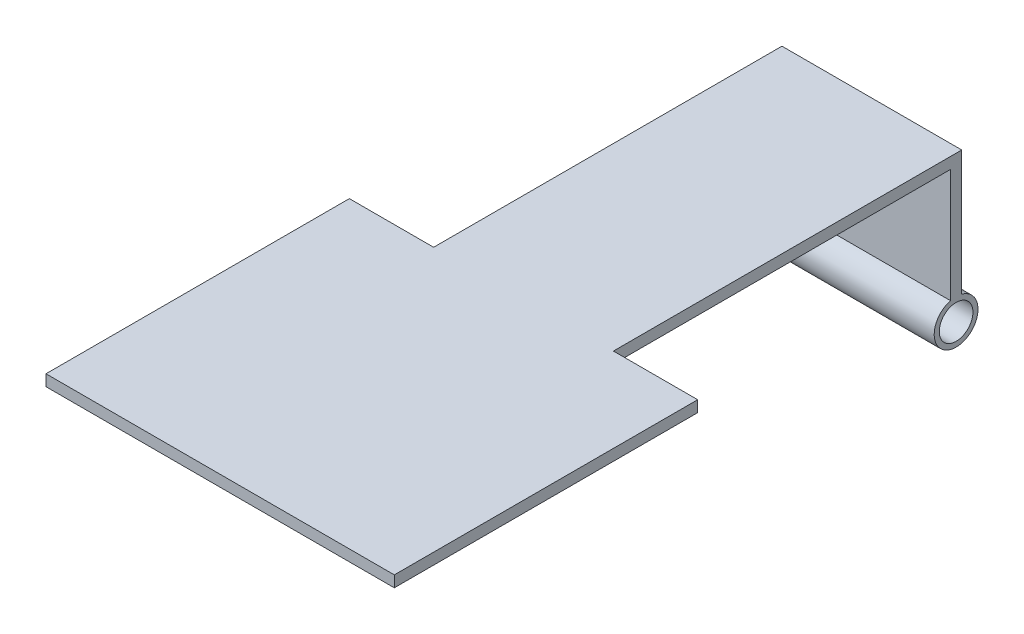
ISO-10303-21;
HEADER;
FILE_DESCRIPTION(('STEP AP214'),'2;1');
FILE_NAME('part.step','',(''),(''),'','','');
FILE_SCHEMA(('AUTOMOTIVE_DESIGN { 1 0 10303 214 1 1 1 1 }'));
ENDSEC;
DATA;
#1=APPLICATION_CONTEXT('core data for automotive mechanical design processes');
#2=APPLICATION_PROTOCOL_DEFINITION('international standard','automotive_design',2000,#1);
#3=PRODUCT_CONTEXT('',#1,'mechanical');
#4=PRODUCT('Part','Part','',(#3));
#5=PRODUCT_RELATED_PRODUCT_CATEGORY('part','',(#4));
#6=PRODUCT_DEFINITION_FORMATION('','',#4);
#7=PRODUCT_DEFINITION_CONTEXT('part definition',#1,'design');
#8=PRODUCT_DEFINITION('design','',#6,#7);
#9=PRODUCT_DEFINITION_SHAPE('','',#8);
#10=(LENGTH_UNIT() NAMED_UNIT(*) SI_UNIT(.MILLI.,.METRE.));
#11=(NAMED_UNIT(*) PLANE_ANGLE_UNIT() SI_UNIT($,.RADIAN.));
#12=(NAMED_UNIT(*) SI_UNIT($,.STERADIAN.) SOLID_ANGLE_UNIT());
#13=UNCERTAINTY_MEASURE_WITH_UNIT(LENGTH_MEASURE(1.E-05),#10,'distance_accuracy_value','');
#14=(GEOMETRIC_REPRESENTATION_CONTEXT(3) GLOBAL_UNCERTAINTY_ASSIGNED_CONTEXT((#13)) GLOBAL_UNIT_ASSIGNED_CONTEXT((#10,
#11,#12)) REPRESENTATION_CONTEXT('',''));
#15=CARTESIAN_POINT('',(0.,0.,0.));
#16=DIRECTION('',(0.,0.,1.));
#17=DIRECTION('',(1.,0.,0.));
#18=AXIS2_PLACEMENT_3D('',#15,#16,#17);
#19=CARTESIAN_POINT('',(16.,0.,0.500534490034142));
#20=DIRECTION('',(0.,0.,-1.));
#21=DIRECTION('',(0.,1.,0.));
#22=AXIS2_PLACEMENT_3D('',#19,#20,#21);
#23=PLANE('',#22);
#24=DIRECTION('',(1.,0.,0.));
#25=VECTOR('',#24,1.);
#26=CARTESIAN_POINT('',(0.,11.9998860247831,0.500534490034143));
#27=LINE('',#26,#25);
#28=CARTESIAN_POINT('',(0.,11.9998860247831,0.500534490034143));
#29=VERTEX_POINT('',#28);
#30=CARTESIAN_POINT('',(16.,11.9998860247831,0.500534490034143));
#31=VERTEX_POINT('',#30);
#32=EDGE_CURVE('E151',#29,#31,#27,.T.);
#33=ORIENTED_EDGE('',*,*,#32,.F.);
#34=DIRECTION('',(0.,-1.,0.));
#35=VECTOR('',#34,1.);
#36=CARTESIAN_POINT('',(0.,0.,0.500534490034142));
#37=LINE('',#36,#35);
#38=CARTESIAN_POINT('',(0.,1.88466581236204,0.500534490034142));
#39=VERTEX_POINT('',#38);
#40=EDGE_CURVE('E194',#29,#39,#37,.T.);
#41=ORIENTED_EDGE('',*,*,#40,.T.);
#42=DIRECTION('',(-1.,0.,0.));
#43=VECTOR('',#42,1.);
#44=CARTESIAN_POINT('',(16.,1.88466581236204,0.500534490034142));
#45=LINE('',#44,#43);
#46=CARTESIAN_POINT('',(16.,1.88466581236204,0.500534490034142));
#47=VERTEX_POINT('',#46);
#48=EDGE_CURVE('E11',#47,#39,#45,.T.);
#49=ORIENTED_EDGE('',*,*,#48,.F.);
#50=DIRECTION('',(0.,-1.,0.));
#51=VECTOR('',#50,1.);
#52=CARTESIAN_POINT('',(16.,0.,0.500534490034142));
#53=LINE('',#52,#51);
#54=EDGE_CURVE('E50',#31,#47,#53,.T.);
#55=ORIENTED_EDGE('',*,*,#54,.F.);
#56=EDGE_LOOP('',(#33,#41,#49,#55));
#57=FACE_BOUND('',#56,.T.);
#58=ADVANCED_FACE('F35',(#57),#23,.F.);
#59=CARTESIAN_POINT('',(16.,0.,0.));
#60=DIRECTION('',(-1.,0.,0.));
#61=DIRECTION('',(0.,0.,1.));
#62=AXIS2_PLACEMENT_3D('',#59,#60,#61);
#63=CYLINDRICAL_SURFACE('',#62,1.95);
#64=CARTESIAN_POINT('',(0.,0.,0.));
#65=DIRECTION('',(1.,0.,0.));
#66=DIRECTION('',(0.,0.,-1.));
#67=AXIS2_PLACEMENT_3D('',#64,#65,#66);
#68=CIRCLE('',#67,1.95);
#69=CARTESIAN_POINT('',(0.,1.88494939039608,-0.499465509965859));
#70=VERTEX_POINT('',#69);
#71=EDGE_CURVE('E196',#39,#70,#68,.T.);
#72=ORIENTED_EDGE('',*,*,#71,.T.);
#73=DIRECTION('',(-1.,0.,0.));
#74=VECTOR('',#73,1.);
#75=CARTESIAN_POINT('',(16.,1.88494939039608,-0.499465509965859));
#76=LINE('',#75,#74);
#77=CARTESIAN_POINT('',(16.,1.88494939039608,-0.499465509965859));
#78=VERTEX_POINT('',#77);
#79=EDGE_CURVE('E43',#78,#70,#76,.T.);
#80=ORIENTED_EDGE('',*,*,#79,.F.);
#81=CARTESIAN_POINT('',(16.,0.,0.));
#82=DIRECTION('',(1.,0.,0.));
#83=DIRECTION('',(0.,0.,-1.));
#84=AXIS2_PLACEMENT_3D('',#81,#82,#83);
#85=CIRCLE('',#84,1.95);
#86=EDGE_CURVE('E186',#47,#78,#85,.T.);
#87=ORIENTED_EDGE('',*,*,#86,.F.);
#88=ORIENTED_EDGE('',*,*,#48,.T.);
#89=EDGE_LOOP('',(#72,#80,#87,#88));
#90=FACE_BOUND('',#89,.T.);
#91=ADVANCED_FACE('F208',(#90),#63,.T.);
#92=CARTESIAN_POINT('',(16.,0.,-0.499465509965859));
#93=DIRECTION('',(0.,0.,-1.));
#94=DIRECTION('',(0.,1.,0.));
#95=AXIS2_PLACEMENT_3D('',#92,#93,#94);
#96=PLANE('',#95);
#97=DIRECTION('',(0.,-1.,0.));
#98=VECTOR('',#97,1.);
#99=CARTESIAN_POINT('',(0.,0.,-0.499465509965859));
#100=LINE('',#99,#98);
#101=CARTESIAN_POINT('',(0.,12.9998860247831,-0.499465509965858));
#102=VERTEX_POINT('',#101);
#103=EDGE_CURVE('E199',#102,#70,#100,.T.);
#104=ORIENTED_EDGE('',*,*,#103,.F.);
#105=DIRECTION('',(-1.,0.,0.));
#106=VECTOR('',#105,1.);
#107=CARTESIAN_POINT('',(16.,12.9998860247831,-0.499465509965858));
#108=LINE('',#107,#106);
#109=CARTESIAN_POINT('',(16.,12.9998860247831,-0.499465509965858));
#110=VERTEX_POINT('',#109);
#111=EDGE_CURVE('E59',#110,#102,#108,.T.);
#112=ORIENTED_EDGE('',*,*,#111,.F.);
#113=DIRECTION('',(0.,-1.,0.));
#114=VECTOR('',#113,1.);
#115=CARTESIAN_POINT('',(16.,0.,-0.499465509965859));
#116=LINE('',#115,#114);
#117=EDGE_CURVE('E188',#110,#78,#116,.T.);
#118=ORIENTED_EDGE('',*,*,#117,.T.);
#119=ORIENTED_EDGE('',*,*,#79,.T.);
#120=EDGE_LOOP('',(#104,#112,#118,#119));
#121=FACE_BOUND('',#120,.T.);
#122=ADVANCED_FACE('F205',(#121),#96,.T.);
#123=CARTESIAN_POINT('',(16.,0.,0.));
#124=DIRECTION('',(-1.,0.,0.));
#125=DIRECTION('',(0.,0.,1.));
#126=AXIS2_PLACEMENT_3D('',#123,#124,#125);
#127=CYLINDRICAL_SURFACE('',#126,1.5);
#128=CARTESIAN_POINT('',(16.,0.,0.));
#129=DIRECTION('',(1.,0.,0.));
#130=DIRECTION('',(0.,0.,-1.));
#131=AXIS2_PLACEMENT_3D('',#128,#129,#130);
#132=CIRCLE('',#131,1.5);
#133=CARTESIAN_POINT('',(16.,0.,-1.5));
#134=VERTEX_POINT('',#133);
#135=EDGE_CURVE('E181',#134,#134,#132,.T.);
#136=ORIENTED_EDGE('',*,*,#135,.T.);
#137=EDGE_LOOP('',(#136));
#138=FACE_BOUND('',#137,.T.);
#139=CARTESIAN_POINT('',(0.,0.,0.));
#140=DIRECTION('',(1.,0.,0.));
#141=DIRECTION('',(0.,0.,-1.));
#142=AXIS2_PLACEMENT_3D('',#139,#140,#141);
#143=CIRCLE('',#142,1.5);
#144=CARTESIAN_POINT('',(0.,0.,-1.5));
#145=VERTEX_POINT('',#144);
#146=EDGE_CURVE('E172',#145,#145,#143,.T.);
#147=ORIENTED_EDGE('',*,*,#146,.F.);
#148=EDGE_LOOP('',(#147));
#149=FACE_BOUND('',#148,.T.);
#150=ADVANCED_FACE('F37',(#138,#149),#127,.F.);
#151=CARTESIAN_POINT('',(16.,12.9998860247831,0.));
#152=DIRECTION('',(0.,1.,0.));
#153=DIRECTION('',(0.,0.,1.));
#154=AXIS2_PLACEMENT_3D('',#151,#152,#153);
#155=PLANE('',#154);
#156=DIRECTION('',(0.,0.,-1.));
#157=VECTOR('',#156,1.);
#158=CARTESIAN_POINT('',(0.,12.9998860247831,0.));
#159=LINE('',#158,#157);
#160=CARTESIAN_POINT('',(0.,12.9998860247831,30.5005344900341));
#161=VERTEX_POINT('',#160);
#162=EDGE_CURVE('E184',#161,#102,#159,.T.);
#163=ORIENTED_EDGE('',*,*,#162,.F.);
#164=DIRECTION('',(-1.,0.,0.));
#165=VECTOR('',#164,1.);
#166=CARTESIAN_POINT('',(0.,12.9998860247831,30.5005344900341));
#167=LINE('',#166,#165);
#168=CARTESIAN_POINT('',(-7.5,12.9998860247831,30.5005344900341));
#169=VERTEX_POINT('',#168);
#170=EDGE_CURVE('E166',#161,#169,#167,.T.);
#171=ORIENTED_EDGE('',*,*,#170,.T.);
#172=DIRECTION('',(0.,0.,1.));
#173=VECTOR('',#172,1.);
#174=CARTESIAN_POINT('',(-7.5,12.9998860247831,0.));
#175=LINE('',#174,#173);
#176=CARTESIAN_POINT('',(-7.5,12.9998860247831,57.5));
#177=VERTEX_POINT('',#176);
#178=EDGE_CURVE('E147',#169,#177,#175,.T.);
#179=ORIENTED_EDGE('',*,*,#178,.T.);
#180=DIRECTION('',(1.,0.,0.));
#181=VECTOR('',#180,1.);
#182=CARTESIAN_POINT('',(0.,12.9998860247831,57.5));
#183=LINE('',#182,#181);
#184=CARTESIAN_POINT('',(23.5,12.9998860247831,57.5));
#185=VERTEX_POINT('',#184);
#186=EDGE_CURVE('E144',#177,#185,#183,.T.);
#187=ORIENTED_EDGE('',*,*,#186,.T.);
#188=DIRECTION('',(0.,0.,1.));
#189=VECTOR('',#188,1.);
#190=CARTESIAN_POINT('',(23.5,12.9998860247831,0.));
#191=LINE('',#190,#189);
#192=CARTESIAN_POINT('',(23.5,12.9998860247831,30.5005344900341));
#193=VERTEX_POINT('',#192);
#194=EDGE_CURVE('E163',#193,#185,#191,.T.);
#195=ORIENTED_EDGE('',*,*,#194,.F.);
#196=DIRECTION('',(1.,0.,0.));
#197=VECTOR('',#196,1.);
#198=CARTESIAN_POINT('',(0.,12.9998860247831,30.5005344900341));
#199=LINE('',#198,#197);
#200=CARTESIAN_POINT('',(16.,12.9998860247831,30.5005344900341));
#201=VERTEX_POINT('',#200);
#202=EDGE_CURVE('E134',#201,#193,#199,.T.);
#203=ORIENTED_EDGE('',*,*,#202,.F.);
#204=DIRECTION('',(0.,0.,-1.));
#205=VECTOR('',#204,1.);
#206=CARTESIAN_POINT('',(16.,12.9998860247831,0.));
#207=LINE('',#206,#205);
#208=EDGE_CURVE('E190',#201,#110,#207,.T.);
#209=ORIENTED_EDGE('',*,*,#208,.T.);
#210=ORIENTED_EDGE('',*,*,#111,.T.);
#211=EDGE_LOOP('',(#163,#171,#179,#187,#195,#203,#209,#210));
#212=FACE_BOUND('',#211,.T.);
#213=ADVANCED_FACE('F212',(#212),#155,.T.);
#214=CARTESIAN_POINT('',(16.,0.,0.));
#215=DIRECTION('',(1.,0.,0.));
#216=DIRECTION('',(0.,0.,-1.));
#217=AXIS2_PLACEMENT_3D('',#214,#215,#216);
#218=PLANE('',#217);
#219=ORIENTED_EDGE('',*,*,#135,.F.);
#220=EDGE_LOOP('',(#219));
#221=FACE_BOUND('',#220,.T.);
#222=ORIENTED_EDGE('',*,*,#208,.F.);
#223=DIRECTION('',(0.,1.,0.));
#224=VECTOR('',#223,1.);
#225=CARTESIAN_POINT('',(16.,11.9998860247831,30.5005344900341));
#226=LINE('',#225,#224);
#227=CARTESIAN_POINT('',(16.,11.9998860247831,30.5005344900341));
#228=VERTEX_POINT('',#227);
#229=EDGE_CURVE('E138',#228,#201,#226,.T.);
#230=ORIENTED_EDGE('',*,*,#229,.F.);
#231=DIRECTION('',(0.,0.,1.));
#232=VECTOR('',#231,1.);
#233=CARTESIAN_POINT('',(16.,11.9998860247831,0.));
#234=LINE('',#233,#232);
#235=EDGE_CURVE('E125',#31,#228,#234,.T.);
#236=ORIENTED_EDGE('',*,*,#235,.F.);
#237=ORIENTED_EDGE('',*,*,#54,.T.);
#238=ORIENTED_EDGE('',*,*,#86,.T.);
#239=ORIENTED_EDGE('',*,*,#117,.F.);
#240=EDGE_LOOP('',(#222,#230,#236,#237,#238,#239));
#241=FACE_BOUND('',#240,.T.);
#242=ADVANCED_FACE('F223',(#221,#241),#218,.T.);
#243=CARTESIAN_POINT('',(0.,0.,0.));
#244=DIRECTION('',(1.,0.,0.));
#245=DIRECTION('',(0.,0.,-1.));
#246=AXIS2_PLACEMENT_3D('',#243,#244,#245);
#247=PLANE('',#246);
#248=ORIENTED_EDGE('',*,*,#146,.T.);
#249=EDGE_LOOP('',(#248));
#250=FACE_BOUND('',#249,.T.);
#251=ORIENTED_EDGE('',*,*,#40,.F.);
#252=DIRECTION('',(0.,0.,1.));
#253=VECTOR('',#252,1.);
#254=CARTESIAN_POINT('',(0.,11.9998860247831,0.));
#255=LINE('',#254,#253);
#256=CARTESIAN_POINT('',(0.,11.9998860247831,30.5005344900341));
#257=VERTEX_POINT('',#256);
#258=EDGE_CURVE('E153',#29,#257,#255,.T.);
#259=ORIENTED_EDGE('',*,*,#258,.T.);
#260=DIRECTION('',(0.,1.,0.));
#261=VECTOR('',#260,1.);
#262=CARTESIAN_POINT('',(0.,11.9998860247831,30.5005344900341));
#263=LINE('',#262,#261);
#264=EDGE_CURVE('E177',#257,#161,#263,.T.);
#265=ORIENTED_EDGE('',*,*,#264,.T.);
#266=ORIENTED_EDGE('',*,*,#162,.T.);
#267=ORIENTED_EDGE('',*,*,#103,.T.);
#268=ORIENTED_EDGE('',*,*,#71,.F.);
#269=EDGE_LOOP('',(#251,#259,#265,#266,#267,#268));
#270=FACE_BOUND('',#269,.T.);
#271=ADVANCED_FACE('F210',(#250,#270),#247,.F.);
#272=CARTESIAN_POINT('',(23.5,11.9998860247831,0.));
#273=DIRECTION('',(-1.,0.,0.));
#274=DIRECTION('',(0.,0.,1.));
#275=AXIS2_PLACEMENT_3D('',#272,#273,#274);
#276=PLANE('',#275);
#277=ORIENTED_EDGE('',*,*,#194,.T.);
#278=DIRECTION('',(0.,1.,0.));
#279=VECTOR('',#278,1.);
#280=CARTESIAN_POINT('',(23.5,11.9998860247831,57.5));
#281=LINE('',#280,#279);
#282=CARTESIAN_POINT('',(23.5,11.9998860247831,57.5));
#283=VERTEX_POINT('',#282);
#284=EDGE_CURVE('E142',#283,#185,#281,.T.);
#285=ORIENTED_EDGE('',*,*,#284,.F.);
#286=DIRECTION('',(0.,0.,1.));
#287=VECTOR('',#286,1.);
#288=CARTESIAN_POINT('',(23.5,11.9998860247831,0.));
#289=LINE('',#288,#287);
#290=CARTESIAN_POINT('',(23.5,11.9998860247831,30.5005344900341));
#291=VERTEX_POINT('',#290);
#292=EDGE_CURVE('E123',#291,#283,#289,.T.);
#293=ORIENTED_EDGE('',*,*,#292,.F.);
#294=DIRECTION('',(0.,1.,0.));
#295=VECTOR('',#294,1.);
#296=CARTESIAN_POINT('',(23.5,11.9998860247831,30.5005344900341));
#297=LINE('',#296,#295);
#298=EDGE_CURVE('E131',#291,#193,#297,.T.);
#299=ORIENTED_EDGE('',*,*,#298,.T.);
#300=EDGE_LOOP('',(#277,#285,#293,#299));
#301=FACE_BOUND('',#300,.T.);
#302=ADVANCED_FACE('F141',(#301),#276,.F.);
#303=CARTESIAN_POINT('',(0.,11.9998860247831,57.5));
#304=DIRECTION('',(0.,0.,1.));
#305=DIRECTION('',(1.,0.,0.));
#306=AXIS2_PLACEMENT_3D('',#303,#304,#305);
#307=PLANE('',#306);
#308=ORIENTED_EDGE('',*,*,#186,.F.);
#309=DIRECTION('',(0.,1.,0.));
#310=VECTOR('',#309,1.);
#311=CARTESIAN_POINT('',(-7.5,11.9998860247831,57.5));
#312=LINE('',#311,#310);
#313=CARTESIAN_POINT('',(-7.5,11.9998860247831,57.5));
#314=VERTEX_POINT('',#313);
#315=EDGE_CURVE('E173',#314,#177,#312,.T.);
#316=ORIENTED_EDGE('',*,*,#315,.F.);
#317=DIRECTION('',(1.,0.,0.));
#318=VECTOR('',#317,1.);
#319=CARTESIAN_POINT('',(0.,11.9998860247831,57.5));
#320=LINE('',#319,#318);
#321=EDGE_CURVE('E139',#314,#283,#320,.T.);
#322=ORIENTED_EDGE('',*,*,#321,.T.);
#323=ORIENTED_EDGE('',*,*,#284,.T.);
#324=EDGE_LOOP('',(#308,#316,#322,#323));
#325=FACE_BOUND('',#324,.T.);
#326=ADVANCED_FACE('F222',(#325),#307,.T.);
#327=CARTESIAN_POINT('',(-7.5,11.9998860247831,0.));
#328=DIRECTION('',(-1.,0.,0.));
#329=DIRECTION('',(0.,0.,1.));
#330=AXIS2_PLACEMENT_3D('',#327,#328,#329);
#331=PLANE('',#330);
#332=ORIENTED_EDGE('',*,*,#178,.F.);
#333=DIRECTION('',(0.,1.,0.));
#334=VECTOR('',#333,1.);
#335=CARTESIAN_POINT('',(-7.5,11.9998860247831,30.5005344900341));
#336=LINE('',#335,#334);
#337=CARTESIAN_POINT('',(-7.5,11.9998860247831,30.5005344900341));
#338=VERTEX_POINT('',#337);
#339=EDGE_CURVE('E175',#338,#169,#336,.T.);
#340=ORIENTED_EDGE('',*,*,#339,.F.);
#341=DIRECTION('',(0.,0.,1.));
#342=VECTOR('',#341,1.);
#343=CARTESIAN_POINT('',(-7.5,11.9998860247831,0.));
#344=LINE('',#343,#342);
#345=EDGE_CURVE('E159',#338,#314,#344,.T.);
#346=ORIENTED_EDGE('',*,*,#345,.T.);
#347=ORIENTED_EDGE('',*,*,#315,.T.);
#348=EDGE_LOOP('',(#332,#340,#346,#347));
#349=FACE_BOUND('',#348,.T.);
#350=ADVANCED_FACE('F220',(#349),#331,.T.);
#351=CARTESIAN_POINT('',(0.,11.9998860247831,30.5005344900341));
#352=DIRECTION('',(0.,0.,-1.));
#353=DIRECTION('',(-1.,0.,0.));
#354=AXIS2_PLACEMENT_3D('',#351,#352,#353);
#355=PLANE('',#354);
#356=ORIENTED_EDGE('',*,*,#170,.F.);
#357=ORIENTED_EDGE('',*,*,#264,.F.);
#358=DIRECTION('',(-1.,0.,0.));
#359=VECTOR('',#358,1.);
#360=CARTESIAN_POINT('',(0.,11.9998860247831,30.5005344900341));
#361=LINE('',#360,#359);
#362=EDGE_CURVE('E156',#257,#338,#361,.T.);
#363=ORIENTED_EDGE('',*,*,#362,.T.);
#364=ORIENTED_EDGE('',*,*,#339,.T.);
#365=EDGE_LOOP('',(#356,#357,#363,#364));
#366=FACE_BOUND('',#365,.T.);
#367=ADVANCED_FACE('F216',(#366),#355,.T.);
#368=CARTESIAN_POINT('',(0.,11.9998860247831,30.5005344900341));
#369=DIRECTION('',(0.,0.,1.));
#370=DIRECTION('',(1.,0.,0.));
#371=AXIS2_PLACEMENT_3D('',#368,#369,#370);
#372=PLANE('',#371);
#373=ORIENTED_EDGE('',*,*,#202,.T.);
#374=ORIENTED_EDGE('',*,*,#298,.F.);
#375=DIRECTION('',(1.,0.,0.));
#376=VECTOR('',#375,1.);
#377=CARTESIAN_POINT('',(0.,11.9998860247831,30.5005344900341));
#378=LINE('',#377,#376);
#379=EDGE_CURVE('E118',#228,#291,#378,.T.);
#380=ORIENTED_EDGE('',*,*,#379,.F.);
#381=ORIENTED_EDGE('',*,*,#229,.T.);
#382=EDGE_LOOP('',(#373,#374,#380,#381));
#383=FACE_BOUND('',#382,.T.);
#384=ADVANCED_FACE('F132',(#383),#372,.F.);
#385=CARTESIAN_POINT('',(0.,11.9998860247831,0.));
#386=DIRECTION('',(0.,1.,0.));
#387=DIRECTION('',(0.,0.,1.));
#388=AXIS2_PLACEMENT_3D('',#385,#386,#387);
#389=PLANE('',#388);
#390=ORIENTED_EDGE('',*,*,#292,.T.);
#391=ORIENTED_EDGE('',*,*,#321,.F.);
#392=ORIENTED_EDGE('',*,*,#345,.F.);
#393=ORIENTED_EDGE('',*,*,#362,.F.);
#394=ORIENTED_EDGE('',*,*,#258,.F.);
#395=ORIENTED_EDGE('',*,*,#32,.T.);
#396=ORIENTED_EDGE('',*,*,#235,.T.);
#397=ORIENTED_EDGE('',*,*,#379,.T.);
#398=EDGE_LOOP('',(#390,#391,#392,#393,#394,#395,#396,#397));
#399=FACE_BOUND('',#398,.T.);
#400=ADVANCED_FACE('F120',(#399),#389,.F.);
#401=CLOSED_SHELL('',(#58,#91,#122,#150,#213,#242,#271,#302,#326,#350,#367,#384,#400));
#402=MANIFOLD_SOLID_BREP('B2',#401);
#403=ADVANCED_BREP_SHAPE_REPRESENTATION('',(#18,#402),#14);
#404=SHAPE_DEFINITION_REPRESENTATION(#9,#403);
ENDSEC;
END-ISO-10303-21;
